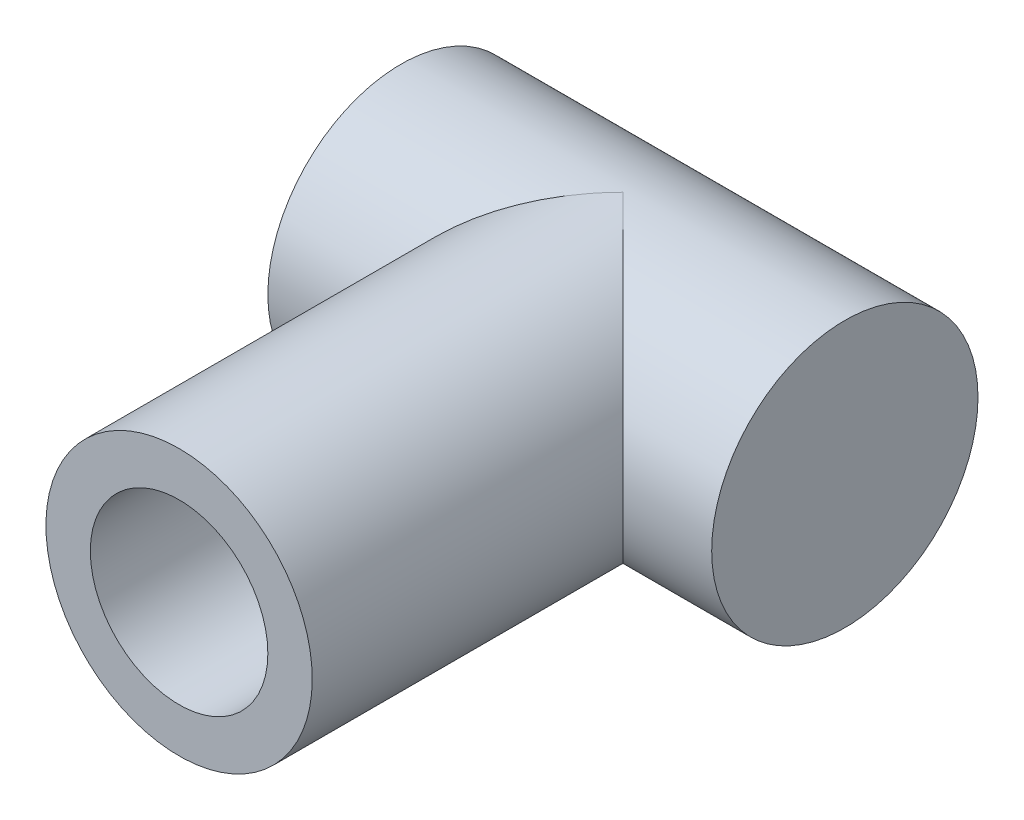
ISO-10303-21;
HEADER;
FILE_DESCRIPTION(('STEP AP214'),'2;1');
FILE_NAME('part.step','',(''),(''),'','','');
FILE_SCHEMA(('AUTOMOTIVE_DESIGN { 1 0 10303 214 1 1 1 1 }'));
ENDSEC;
DATA;
#1=APPLICATION_CONTEXT('core data for automotive mechanical design processes');
#2=APPLICATION_PROTOCOL_DEFINITION('international standard','automotive_design',2000,#1);
#3=PRODUCT_CONTEXT('',#1,'mechanical');
#4=PRODUCT('Part','Part','',(#3));
#5=PRODUCT_RELATED_PRODUCT_CATEGORY('part','',(#4));
#6=PRODUCT_DEFINITION_FORMATION('','',#4);
#7=PRODUCT_DEFINITION_CONTEXT('part definition',#1,'design');
#8=PRODUCT_DEFINITION('design','',#6,#7);
#9=PRODUCT_DEFINITION_SHAPE('','',#8);
#10=(LENGTH_UNIT() NAMED_UNIT(*) SI_UNIT(.MILLI.,.METRE.));
#11=(NAMED_UNIT(*) PLANE_ANGLE_UNIT() SI_UNIT($,.RADIAN.));
#12=(NAMED_UNIT(*) SI_UNIT($,.STERADIAN.) SOLID_ANGLE_UNIT());
#13=UNCERTAINTY_MEASURE_WITH_UNIT(LENGTH_MEASURE(1.E-05),#10,'distance_accuracy_value','');
#14=(GEOMETRIC_REPRESENTATION_CONTEXT(3) GLOBAL_UNCERTAINTY_ASSIGNED_CONTEXT((#13)) GLOBAL_UNIT_ASSIGNED_CONTEXT((#10,
#11,#12)) REPRESENTATION_CONTEXT('',''));
#15=CARTESIAN_POINT('',(0.,0.,0.));
#16=DIRECTION('',(0.,0.,1.));
#17=DIRECTION('',(1.,0.,0.));
#18=AXIS2_PLACEMENT_3D('',#15,#16,#17);
#19=CARTESIAN_POINT('',(125.,0.,0.));
#20=DIRECTION('',(-1.,0.,0.));
#21=DIRECTION('',(0.,0.,1.));
#22=AXIS2_PLACEMENT_3D('',#19,#20,#21);
#23=CYLINDRICAL_SURFACE('',#22,75.);
#24=CARTESIAN_POINT('',(-125.,0.,0.));
#25=DIRECTION('',(1.,0.,0.));
#26=DIRECTION('',(0.,0.,-1.));
#27=AXIS2_PLACEMENT_3D('',#24,#25,#26);
#28=CIRCLE('',#27,75.);
#29=CARTESIAN_POINT('',(-125.,0.,-75.));
#30=VERTEX_POINT('',#29);
#31=EDGE_CURVE('E50',#30,#30,#28,.T.);
#32=ORIENTED_EDGE('',*,*,#31,.T.);
#33=EDGE_LOOP('',(#32));
#34=FACE_BOUND('',#33,.T.);
#35=CARTESIAN_POINT('',(125.,0.,0.));
#36=DIRECTION('',(1.,0.,0.));
#37=DIRECTION('',(0.,0.,-1.));
#38=AXIS2_PLACEMENT_3D('',#35,#36,#37);
#39=CIRCLE('',#38,75.);
#40=CARTESIAN_POINT('',(125.,0.,-75.));
#41=VERTEX_POINT('',#40);
#42=EDGE_CURVE('E48',#41,#41,#39,.T.);
#43=ORIENTED_EDGE('',*,*,#42,.F.);
#44=EDGE_LOOP('',(#43));
#45=FACE_BOUND('',#44,.T.);
#46=CARTESIAN_POINT('',(0.,0.,0.));
#47=DIRECTION('',(-0.707106781186547,0.,-0.707106781186547));
#48=DIRECTION('',(-0.707106781186547,0.,0.707106781186547));
#49=AXIS2_PLACEMENT_3D('',#46,#47,#48);
#50=ELLIPSE('',#49,106.066017177982,75.);
#51=CARTESIAN_POINT('',(0.,75.,0.));
#52=VERTEX_POINT('',#51);
#53=CARTESIAN_POINT('',(0.,-75.,0.));
#54=VERTEX_POINT('',#53);
#55=EDGE_CURVE('E11',#52,#54,#50,.F.);
#56=ORIENTED_EDGE('',*,*,#55,.F.);
#57=CARTESIAN_POINT('',(0.,0.,0.));
#58=DIRECTION('',(-0.707106781186547,0.,0.707106781186547));
#59=DIRECTION('',(-0.707106781186547,0.,-0.707106781186547));
#60=AXIS2_PLACEMENT_3D('',#57,#58,#59);
#61=ELLIPSE('',#60,106.066017177982,75.);
#62=EDGE_CURVE('E40',#54,#52,#61,.T.);
#63=ORIENTED_EDGE('',*,*,#62,.F.);
#64=EDGE_LOOP('',(#56,#63));
#65=FACE_BOUND('',#64,.T.);
#66=ADVANCED_FACE('F33',(#34,#45,#65),#23,.T.);
#67=CARTESIAN_POINT('',(125.,0.,0.));
#68=DIRECTION('',(1.,0.,0.));
#69=DIRECTION('',(0.,0.,-1.));
#70=AXIS2_PLACEMENT_3D('',#67,#68,#69);
#71=PLANE('',#70);
#72=ORIENTED_EDGE('',*,*,#42,.T.);
#73=EDGE_LOOP('',(#72));
#74=FACE_BOUND('',#73,.T.);
#75=ADVANCED_FACE('F85',(#74),#71,.T.);
#76=CARTESIAN_POINT('',(-125.,0.,0.));
#77=DIRECTION('',(1.,0.,0.));
#78=DIRECTION('',(0.,0.,-1.));
#79=AXIS2_PLACEMENT_3D('',#76,#77,#78);
#80=PLANE('',#79);
#81=ORIENTED_EDGE('',*,*,#31,.F.);
#82=EDGE_LOOP('',(#81));
#83=FACE_BOUND('',#82,.T.);
#84=ADVANCED_FACE('F80',(#83),#80,.F.);
#85=CARTESIAN_POINT('',(0.,0.,250.));
#86=DIRECTION('',(0.,0.,-1.));
#87=DIRECTION('',(-1.,0.,0.));
#88=AXIS2_PLACEMENT_3D('',#85,#86,#87);
#89=CYLINDRICAL_SURFACE('',#88,75.);
#90=CARTESIAN_POINT('',(0.,0.,250.));
#91=DIRECTION('',(0.,0.,1.));
#92=DIRECTION('',(1.,0.,0.));
#93=AXIS2_PLACEMENT_3D('',#90,#91,#92);
#94=CIRCLE('',#93,75.);
#95=CARTESIAN_POINT('',(75.,0.,250.));
#96=VERTEX_POINT('',#95);
#97=EDGE_CURVE('E54',#96,#96,#94,.T.);
#98=ORIENTED_EDGE('',*,*,#97,.F.);
#99=EDGE_LOOP('',(#98));
#100=FACE_BOUND('',#99,.T.);
#101=ORIENTED_EDGE('',*,*,#62,.T.);
#102=ORIENTED_EDGE('',*,*,#55,.T.);
#103=EDGE_LOOP('',(#101,#102));
#104=FACE_BOUND('',#103,.T.);
#105=ADVANCED_FACE('F47',(#100,#104),#89,.T.);
#106=CARTESIAN_POINT('',(0.,0.,250.));
#107=DIRECTION('',(0.,0.,1.));
#108=DIRECTION('',(1.,0.,0.));
#109=AXIS2_PLACEMENT_3D('',#106,#107,#108);
#110=PLANE('',#109);
#111=CARTESIAN_POINT('',(0.,0.,250.));
#112=DIRECTION('',(0.,0.,1.));
#113=DIRECTION('',(1.,0.,0.));
#114=AXIS2_PLACEMENT_3D('',#111,#112,#113);
#115=CIRCLE('',#114,50.);
#116=CARTESIAN_POINT('',(50.,0.,250.));
#117=VERTEX_POINT('',#116);
#118=EDGE_CURVE('E59',#117,#117,#115,.T.);
#119=ORIENTED_EDGE('',*,*,#118,.F.);
#120=EDGE_LOOP('',(#119));
#121=FACE_BOUND('',#120,.T.);
#122=ORIENTED_EDGE('',*,*,#97,.T.);
#123=EDGE_LOOP('',(#122));
#124=FACE_BOUND('',#123,.T.);
#125=ADVANCED_FACE('F70',(#121,#124),#110,.T.);
#126=CARTESIAN_POINT('',(0.,0.,100.));
#127=DIRECTION('',(0.,0.,1.));
#128=DIRECTION('',(1.,0.,0.));
#129=AXIS2_PLACEMENT_3D('',#126,#127,#128);
#130=CYLINDRICAL_SURFACE('',#129,50.);
#131=CARTESIAN_POINT('',(0.,0.,100.));
#132=DIRECTION('',(0.,0.,1.));
#133=DIRECTION('',(1.,0.,0.));
#134=AXIS2_PLACEMENT_3D('',#131,#132,#133);
#135=CIRCLE('',#134,50.);
#136=CARTESIAN_POINT('',(50.,0.,100.));
#137=VERTEX_POINT('',#136);
#138=EDGE_CURVE('E58',#137,#137,#135,.T.);
#139=ORIENTED_EDGE('',*,*,#138,.F.);
#140=EDGE_LOOP('',(#139));
#141=FACE_BOUND('',#140,.T.);
#142=ORIENTED_EDGE('',*,*,#118,.T.);
#143=EDGE_LOOP('',(#142));
#144=FACE_BOUND('',#143,.T.);
#145=ADVANCED_FACE('F67',(#141,#144),#130,.F.);
#146=CARTESIAN_POINT('',(0.,0.,100.));
#147=DIRECTION('',(0.,0.,1.));
#148=DIRECTION('',(1.,0.,0.));
#149=AXIS2_PLACEMENT_3D('',#146,#147,#148);
#150=PLANE('',#149);
#151=ORIENTED_EDGE('',*,*,#138,.T.);
#152=EDGE_LOOP('',(#151));
#153=FACE_BOUND('',#152,.T.);
#154=ADVANCED_FACE('F65',(#153),#150,.T.);
#155=CLOSED_SHELL('',(#66,#75,#84,#105,#125,#145,#154));
#156=MANIFOLD_SOLID_BREP('B2',#155);
#157=ADVANCED_BREP_SHAPE_REPRESENTATION('',(#18,#156),#14);
#158=SHAPE_DEFINITION_REPRESENTATION(#9,#157);
ENDSEC;
END-ISO-10303-21;
